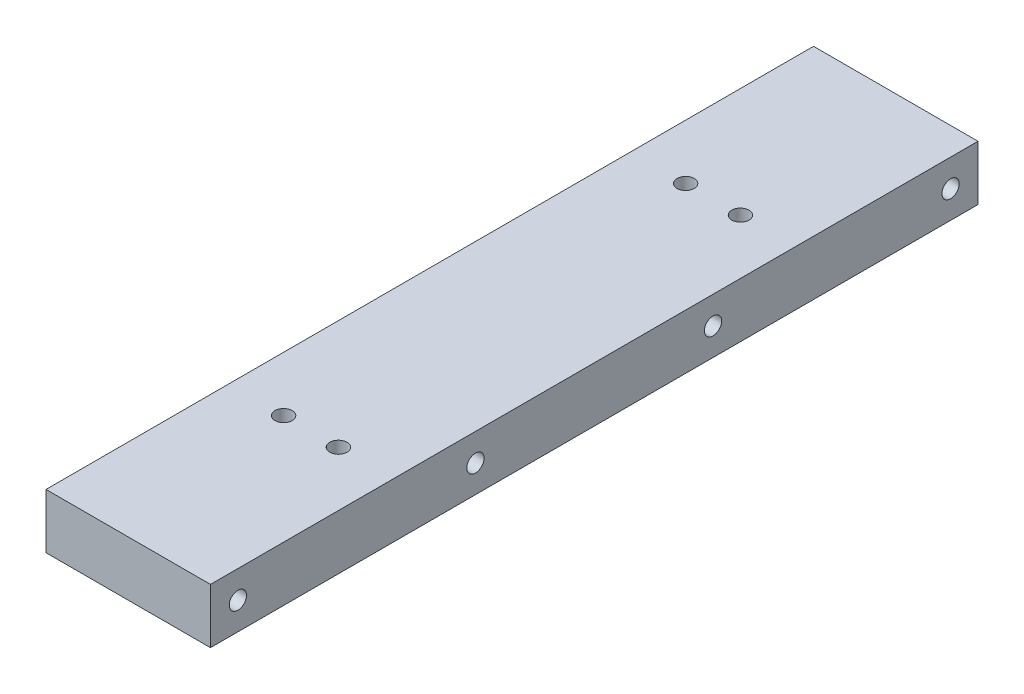
ISO-10303-21;
HEADER;
FILE_DESCRIPTION(('STEP AP214'),'2;1');
FILE_NAME('part.step','',(''),(''),'','','');
FILE_SCHEMA(('AUTOMOTIVE_DESIGN { 1 0 10303 214 1 1 1 1 }'));
ENDSEC;
DATA;
#1=APPLICATION_CONTEXT('core data for automotive mechanical design processes');
#2=APPLICATION_PROTOCOL_DEFINITION('international standard','automotive_design',2000,#1);
#3=PRODUCT_CONTEXT('',#1,'mechanical');
#4=PRODUCT('Part','Part','',(#3));
#5=PRODUCT_RELATED_PRODUCT_CATEGORY('part','',(#4));
#6=PRODUCT_DEFINITION_FORMATION('','',#4);
#7=PRODUCT_DEFINITION_CONTEXT('part definition',#1,'design');
#8=PRODUCT_DEFINITION('design','',#6,#7);
#9=PRODUCT_DEFINITION_SHAPE('','',#8);
#10=(LENGTH_UNIT() NAMED_UNIT(*) SI_UNIT(.MILLI.,.METRE.));
#11=(NAMED_UNIT(*) PLANE_ANGLE_UNIT() SI_UNIT($,.RADIAN.));
#12=(NAMED_UNIT(*) SI_UNIT($,.STERADIAN.) SOLID_ANGLE_UNIT());
#13=UNCERTAINTY_MEASURE_WITH_UNIT(LENGTH_MEASURE(1.E-05),#10,'distance_accuracy_value','');
#14=(GEOMETRIC_REPRESENTATION_CONTEXT(3) GLOBAL_UNCERTAINTY_ASSIGNED_CONTEXT((#13)) GLOBAL_UNIT_ASSIGNED_CONTEXT((#10,
#11,#12)) REPRESENTATION_CONTEXT('',''));
#15=CARTESIAN_POINT('',(0.,0.,0.));
#16=DIRECTION('',(0.,0.,1.));
#17=DIRECTION('',(1.,0.,0.));
#18=AXIS2_PLACEMENT_3D('',#15,#16,#17);
#19=CARTESIAN_POINT('',(28.575,4.7625,-128.5875));
#20=DIRECTION('',(1.,0.,0.));
#21=DIRECTION('',(0.,0.,-1.));
#22=AXIS2_PLACEMENT_3D('',#19,#20,#21);
#23=CYLINDRICAL_SURFACE('',#22,1.5);
#24=CARTESIAN_POINT('',(0.,4.7625,-128.5875));
#25=DIRECTION('',(1.,0.,0.));
#26=DIRECTION('',(0.,0.,-1.));
#27=AXIS2_PLACEMENT_3D('',#24,#25,#26);
#28=CIRCLE('',#27,1.49999999999999);
#29=CARTESIAN_POINT('',(0.,4.7625,-130.0875));
#30=VERTEX_POINT('',#29);
#31=EDGE_CURVE('E56',#30,#30,#28,.T.);
#32=ORIENTED_EDGE('',*,*,#31,.F.);
#33=EDGE_LOOP('',(#32));
#34=FACE_BOUND('',#33,.T.);
#35=CARTESIAN_POINT('',(28.575,4.7625,-128.5875));
#36=DIRECTION('',(1.,0.,0.));
#37=DIRECTION('',(0.,0.,-1.));
#38=AXIS2_PLACEMENT_3D('',#35,#36,#37);
#39=CIRCLE('',#38,1.5);
#40=CARTESIAN_POINT('',(28.575,4.7625,-130.0875));
#41=VERTEX_POINT('',#40);
#42=EDGE_CURVE('E11',#41,#41,#39,.T.);
#43=ORIENTED_EDGE('',*,*,#42,.T.);
#44=EDGE_LOOP('',(#43));
#45=FACE_BOUND('',#44,.T.);
#46=ADVANCED_FACE('F47',(#34,#45),#23,.F.);
#47=CARTESIAN_POINT('',(28.575,4.7625,-87.3125));
#48=DIRECTION('',(1.,0.,0.));
#49=DIRECTION('',(0.,0.,-1.));
#50=AXIS2_PLACEMENT_3D('',#47,#48,#49);
#51=CYLINDRICAL_SURFACE('',#50,1.5);
#52=CARTESIAN_POINT('',(0.,4.7625,-87.3125));
#53=DIRECTION('',(1.,0.,0.));
#54=DIRECTION('',(0.,0.,-1.));
#55=AXIS2_PLACEMENT_3D('',#52,#53,#54);
#56=CIRCLE('',#55,1.49999999999999);
#57=CARTESIAN_POINT('',(0.,4.7625,-88.8125));
#58=VERTEX_POINT('',#57);
#59=EDGE_CURVE('E137',#58,#58,#56,.T.);
#60=ORIENTED_EDGE('',*,*,#59,.F.);
#61=EDGE_LOOP('',(#60));
#62=FACE_BOUND('',#61,.T.);
#63=CARTESIAN_POINT('',(28.575,4.7625,-87.3125));
#64=DIRECTION('',(1.,0.,0.));
#65=DIRECTION('',(0.,0.,-1.));
#66=AXIS2_PLACEMENT_3D('',#63,#64,#65);
#67=CIRCLE('',#66,1.5);
#68=CARTESIAN_POINT('',(28.575,4.7625,-88.8125));
#69=VERTEX_POINT('',#68);
#70=EDGE_CURVE('E141',#69,#69,#67,.T.);
#71=ORIENTED_EDGE('',*,*,#70,.T.);
#72=EDGE_LOOP('',(#71));
#73=FACE_BOUND('',#72,.T.);
#74=ADVANCED_FACE('F152',(#62,#73),#51,.F.);
#75=CARTESIAN_POINT('',(0.,9.525,-133.35));
#76=DIRECTION('',(1.,0.,0.));
#77=DIRECTION('',(0.,0.,-1.));
#78=AXIS2_PLACEMENT_3D('',#75,#76,#77);
#79=PLANE('',#78);
#80=CARTESIAN_POINT('',(0.,4.7625,-46.0375));
#81=DIRECTION('',(1.,0.,0.));
#82=DIRECTION('',(0.,0.,-1.));
#83=AXIS2_PLACEMENT_3D('',#80,#81,#82);
#84=CIRCLE('',#83,1.49999999999999);
#85=CARTESIAN_POINT('',(0.,4.7625,-47.5375));
#86=VERTEX_POINT('',#85);
#87=EDGE_CURVE('E291',#86,#86,#84,.T.);
#88=ORIENTED_EDGE('',*,*,#87,.T.);
#89=EDGE_LOOP('',(#88));
#90=FACE_BOUND('',#89,.T.);
#91=CARTESIAN_POINT('',(0.,4.7625,-4.7625));
#92=DIRECTION('',(1.,0.,0.));
#93=DIRECTION('',(0.,0.,-1.));
#94=AXIS2_PLACEMENT_3D('',#91,#92,#93);
#95=CIRCLE('',#94,1.49999999999999);
#96=CARTESIAN_POINT('',(0.,4.7625,-6.2625));
#97=VERTEX_POINT('',#96);
#98=EDGE_CURVE('E124',#97,#97,#95,.T.);
#99=ORIENTED_EDGE('',*,*,#98,.T.);
#100=EDGE_LOOP('',(#99));
#101=FACE_BOUND('',#100,.T.);
#102=DIRECTION('',(0.,0.,1.));
#103=VECTOR('',#102,1.);
#104=CARTESIAN_POINT('',(0.,0.,-133.35));
#105=LINE('',#104,#103);
#106=CARTESIAN_POINT('',(0.,0.,-133.35));
#107=VERTEX_POINT('',#106);
#108=CARTESIAN_POINT('',(0.,0.,0.));
#109=VERTEX_POINT('',#108);
#110=EDGE_CURVE('E120',#107,#109,#105,.T.);
#111=ORIENTED_EDGE('',*,*,#110,.T.);
#112=DIRECTION('',(0.,-1.,0.));
#113=VECTOR('',#112,1.);
#114=CARTESIAN_POINT('',(0.,9.525,0.));
#115=LINE('',#114,#113);
#116=CARTESIAN_POINT('',(0.,9.525,0.));
#117=VERTEX_POINT('',#116);
#118=EDGE_CURVE('E108',#117,#109,#115,.T.);
#119=ORIENTED_EDGE('',*,*,#118,.F.);
#120=DIRECTION('',(0.,0.,1.));
#121=VECTOR('',#120,1.);
#122=CARTESIAN_POINT('',(0.,9.525,-133.35));
#123=LINE('',#122,#121);
#124=CARTESIAN_POINT('',(0.,9.525,-133.35));
#125=VERTEX_POINT('',#124);
#126=EDGE_CURVE('E100',#125,#117,#123,.T.);
#127=ORIENTED_EDGE('',*,*,#126,.F.);
#128=DIRECTION('',(0.,-1.,0.));
#129=VECTOR('',#128,1.);
#130=CARTESIAN_POINT('',(0.,9.525,-133.35));
#131=LINE('',#130,#129);
#132=EDGE_CURVE('E116',#125,#107,#131,.T.);
#133=ORIENTED_EDGE('',*,*,#132,.T.);
#134=EDGE_LOOP('',(#111,#119,#127,#133));
#135=FACE_BOUND('',#134,.T.);
#136=ORIENTED_EDGE('',*,*,#59,.T.);
#137=EDGE_LOOP('',(#136));
#138=FACE_BOUND('',#137,.T.);
#139=ORIENTED_EDGE('',*,*,#31,.T.);
#140=EDGE_LOOP('',(#139));
#141=FACE_BOUND('',#140,.T.);
#142=ADVANCED_FACE('F148',(#90,#101,#135,#138,#141),#79,.F.);
#143=CARTESIAN_POINT('',(0.,9.525,0.));
#144=DIRECTION('',(0.,0.,-1.));
#145=DIRECTION('',(-1.,0.,0.));
#146=AXIS2_PLACEMENT_3D('',#143,#144,#145);
#147=PLANE('',#146);
#148=DIRECTION('',(1.,0.,0.));
#149=VECTOR('',#148,1.);
#150=CARTESIAN_POINT('',(0.,0.,0.));
#151=LINE('',#150,#149);
#152=CARTESIAN_POINT('',(28.575,0.,0.));
#153=VERTEX_POINT('',#152);
#154=EDGE_CURVE('E106',#109,#153,#151,.T.);
#155=ORIENTED_EDGE('',*,*,#154,.T.);
#156=DIRECTION('',(0.,-1.,0.));
#157=VECTOR('',#156,1.);
#158=CARTESIAN_POINT('',(28.575,9.525,0.));
#159=LINE('',#158,#157);
#160=CARTESIAN_POINT('',(28.575,9.525,0.));
#161=VERTEX_POINT('',#160);
#162=EDGE_CURVE('E104',#161,#153,#159,.T.);
#163=ORIENTED_EDGE('',*,*,#162,.F.);
#164=DIRECTION('',(1.,0.,0.));
#165=VECTOR('',#164,1.);
#166=CARTESIAN_POINT('',(0.,9.525,0.));
#167=LINE('',#166,#165);
#168=EDGE_CURVE('E95',#117,#161,#167,.T.);
#169=ORIENTED_EDGE('',*,*,#168,.F.);
#170=ORIENTED_EDGE('',*,*,#118,.T.);
#171=EDGE_LOOP('',(#155,#163,#169,#170));
#172=FACE_BOUND('',#171,.T.);
#173=ADVANCED_FACE('F105',(#172),#147,.F.);
#174=CARTESIAN_POINT('',(28.575,9.525,0.));
#175=DIRECTION('',(-1.,0.,0.));
#176=DIRECTION('',(0.,0.,1.));
#177=AXIS2_PLACEMENT_3D('',#174,#175,#176);
#178=PLANE('',#177);
#179=CARTESIAN_POINT('',(28.575,4.7625,-46.0375));
#180=DIRECTION('',(1.,0.,0.));
#181=DIRECTION('',(0.,0.,-1.));
#182=AXIS2_PLACEMENT_3D('',#179,#180,#181);
#183=CIRCLE('',#182,1.5);
#184=CARTESIAN_POINT('',(28.575,4.7625,-47.5375));
#185=VERTEX_POINT('',#184);
#186=EDGE_CURVE('E293',#185,#185,#183,.T.);
#187=ORIENTED_EDGE('',*,*,#186,.F.);
#188=EDGE_LOOP('',(#187));
#189=FACE_BOUND('',#188,.T.);
#190=CARTESIAN_POINT('',(28.575,4.7625,-4.7625));
#191=DIRECTION('',(1.,0.,0.));
#192=DIRECTION('',(0.,0.,-1.));
#193=AXIS2_PLACEMENT_3D('',#190,#191,#192);
#194=CIRCLE('',#193,1.5);
#195=CARTESIAN_POINT('',(28.575,4.7625,-6.2625));
#196=VERTEX_POINT('',#195);
#197=EDGE_CURVE('E295',#196,#196,#194,.T.);
#198=ORIENTED_EDGE('',*,*,#197,.F.);
#199=EDGE_LOOP('',(#198));
#200=FACE_BOUND('',#199,.T.);
#201=DIRECTION('',(0.,0.,-1.));
#202=VECTOR('',#201,1.);
#203=CARTESIAN_POINT('',(28.575,0.,0.));
#204=LINE('',#203,#202);
#205=CARTESIAN_POINT('',(28.575,0.,-133.35));
#206=VERTEX_POINT('',#205);
#207=EDGE_CURVE('E81',#153,#206,#204,.T.);
#208=ORIENTED_EDGE('',*,*,#207,.T.);
#209=DIRECTION('',(0.,-1.,0.));
#210=VECTOR('',#209,1.);
#211=CARTESIAN_POINT('',(28.575,9.525,-133.35));
#212=LINE('',#211,#210);
#213=CARTESIAN_POINT('',(28.575,9.525,-133.35));
#214=VERTEX_POINT('',#213);
#215=EDGE_CURVE('E109',#214,#206,#212,.T.);
#216=ORIENTED_EDGE('',*,*,#215,.F.);
#217=DIRECTION('',(0.,0.,-1.));
#218=VECTOR('',#217,1.);
#219=CARTESIAN_POINT('',(28.575,9.525,0.));
#220=LINE('',#219,#218);
#221=EDGE_CURVE('E98',#161,#214,#220,.T.);
#222=ORIENTED_EDGE('',*,*,#221,.F.);
#223=ORIENTED_EDGE('',*,*,#162,.T.);
#224=EDGE_LOOP('',(#208,#216,#222,#223));
#225=FACE_BOUND('',#224,.T.);
#226=ORIENTED_EDGE('',*,*,#70,.F.);
#227=EDGE_LOOP('',(#226));
#228=FACE_BOUND('',#227,.T.);
#229=ORIENTED_EDGE('',*,*,#42,.F.);
#230=EDGE_LOOP('',(#229));
#231=FACE_BOUND('',#230,.T.);
#232=ADVANCED_FACE('F111',(#189,#200,#225,#228,#231),#178,.F.);
#233=CARTESIAN_POINT('',(28.575,9.525,-133.35));
#234=DIRECTION('',(0.,0.,1.));
#235=DIRECTION('',(1.,0.,0.));
#236=AXIS2_PLACEMENT_3D('',#233,#234,#235);
#237=PLANE('',#236);
#238=DIRECTION('',(-1.,0.,0.));
#239=VECTOR('',#238,1.);
#240=CARTESIAN_POINT('',(28.575,0.,-133.35));
#241=LINE('',#240,#239);
#242=EDGE_CURVE('E87',#206,#107,#241,.T.);
#243=ORIENTED_EDGE('',*,*,#242,.T.);
#244=ORIENTED_EDGE('',*,*,#132,.F.);
#245=DIRECTION('',(-1.,0.,0.));
#246=VECTOR('',#245,1.);
#247=CARTESIAN_POINT('',(28.575,9.525,-133.35));
#248=LINE('',#247,#246);
#249=EDGE_CURVE('E64',#214,#125,#248,.T.);
#250=ORIENTED_EDGE('',*,*,#249,.F.);
#251=ORIENTED_EDGE('',*,*,#215,.T.);
#252=EDGE_LOOP('',(#243,#244,#250,#251));
#253=FACE_BOUND('',#252,.T.);
#254=ADVANCED_FACE('F156',(#253),#237,.F.);
#255=CARTESIAN_POINT('',(0.,9.525,0.));
#256=DIRECTION('',(0.,1.,0.));
#257=DIRECTION('',(0.,0.,1.));
#258=AXIS2_PLACEMENT_3D('',#255,#256,#257);
#259=PLANE('',#258);
#260=CARTESIAN_POINT('',(19.05,9.525,-31.75));
#261=DIRECTION('',(0.,-1.,0.));
#262=DIRECTION('',(0.,0.,-1.));
#263=AXIS2_PLACEMENT_3D('',#260,#261,#262);
#264=CIRCLE('',#263,1.5);
#265=CARTESIAN_POINT('',(19.05,9.525,-33.25));
#266=VERTEX_POINT('',#265);
#267=EDGE_CURVE('E323',#266,#266,#264,.T.);
#268=ORIENTED_EDGE('',*,*,#267,.T.);
#269=EDGE_LOOP('',(#268));
#270=FACE_BOUND('',#269,.T.);
#271=CARTESIAN_POINT('',(19.05,9.525,-101.6));
#272=DIRECTION('',(0.,-1.,0.));
#273=DIRECTION('',(0.,0.,-1.));
#274=AXIS2_PLACEMENT_3D('',#271,#272,#273);
#275=CIRCLE('',#274,1.5);
#276=CARTESIAN_POINT('',(19.05,9.525,-103.1));
#277=VERTEX_POINT('',#276);
#278=EDGE_CURVE('E331',#277,#277,#275,.T.);
#279=ORIENTED_EDGE('',*,*,#278,.T.);
#280=EDGE_LOOP('',(#279));
#281=FACE_BOUND('',#280,.T.);
#282=CARTESIAN_POINT('',(9.525,9.525,-101.6));
#283=DIRECTION('',(0.,-1.,0.));
#284=DIRECTION('',(0.,0.,-1.));
#285=AXIS2_PLACEMENT_3D('',#282,#283,#284);
#286=CIRCLE('',#285,1.5);
#287=CARTESIAN_POINT('',(9.525,9.525,-103.1));
#288=VERTEX_POINT('',#287);
#289=EDGE_CURVE('E339',#288,#288,#286,.T.);
#290=ORIENTED_EDGE('',*,*,#289,.T.);
#291=EDGE_LOOP('',(#290));
#292=FACE_BOUND('',#291,.T.);
#293=CARTESIAN_POINT('',(9.525,9.525,-31.75));
#294=DIRECTION('',(0.,-1.,0.));
#295=DIRECTION('',(0.,0.,-1.));
#296=AXIS2_PLACEMENT_3D('',#293,#294,#295);
#297=CIRCLE('',#296,1.5);
#298=CARTESIAN_POINT('',(9.525,9.525,-33.25));
#299=VERTEX_POINT('',#298);
#300=EDGE_CURVE('E301',#299,#299,#297,.T.);
#301=ORIENTED_EDGE('',*,*,#300,.T.);
#302=EDGE_LOOP('',(#301));
#303=FACE_BOUND('',#302,.T.);
#304=ORIENTED_EDGE('',*,*,#126,.T.);
#305=ORIENTED_EDGE('',*,*,#168,.T.);
#306=ORIENTED_EDGE('',*,*,#221,.T.);
#307=ORIENTED_EDGE('',*,*,#249,.T.);
#308=EDGE_LOOP('',(#304,#305,#306,#307));
#309=FACE_BOUND('',#308,.T.);
#310=ADVANCED_FACE('F96',(#270,#281,#292,#303,#309),#259,.T.);
#311=CARTESIAN_POINT('',(0.,0.,0.));
#312=DIRECTION('',(0.,1.,0.));
#313=DIRECTION('',(0.,0.,1.));
#314=AXIS2_PLACEMENT_3D('',#311,#312,#313);
#315=PLANE('',#314);
#316=CARTESIAN_POINT('',(19.05,0.,-31.75));
#317=DIRECTION('',(0.,-1.,0.));
#318=DIRECTION('',(0.,0.,-1.));
#319=AXIS2_PLACEMENT_3D('',#316,#317,#318);
#320=CIRCLE('',#319,1.5);
#321=CARTESIAN_POINT('',(19.05,0.,-33.25));
#322=VERTEX_POINT('',#321);
#323=EDGE_CURVE('E327',#322,#322,#320,.T.);
#324=ORIENTED_EDGE('',*,*,#323,.F.);
#325=EDGE_LOOP('',(#324));
#326=FACE_BOUND('',#325,.T.);
#327=CARTESIAN_POINT('',(19.05,0.,-101.6));
#328=DIRECTION('',(0.,-1.,0.));
#329=DIRECTION('',(0.,0.,-1.));
#330=AXIS2_PLACEMENT_3D('',#327,#328,#329);
#331=CIRCLE('',#330,1.5);
#332=CARTESIAN_POINT('',(19.05,0.,-103.1));
#333=VERTEX_POINT('',#332);
#334=EDGE_CURVE('E335',#333,#333,#331,.T.);
#335=ORIENTED_EDGE('',*,*,#334,.F.);
#336=EDGE_LOOP('',(#335));
#337=FACE_BOUND('',#336,.T.);
#338=CARTESIAN_POINT('',(9.525,0.,-101.6));
#339=DIRECTION('',(0.,-1.,0.));
#340=DIRECTION('',(0.,0.,-1.));
#341=AXIS2_PLACEMENT_3D('',#338,#339,#340);
#342=CIRCLE('',#341,1.5);
#343=CARTESIAN_POINT('',(9.525,0.,-103.1));
#344=VERTEX_POINT('',#343);
#345=EDGE_CURVE('E319',#344,#344,#342,.T.);
#346=ORIENTED_EDGE('',*,*,#345,.F.);
#347=EDGE_LOOP('',(#346));
#348=FACE_BOUND('',#347,.T.);
#349=CARTESIAN_POINT('',(9.525,0.,-31.75));
#350=DIRECTION('',(0.,-1.,0.));
#351=DIRECTION('',(0.,0.,-1.));
#352=AXIS2_PLACEMENT_3D('',#349,#350,#351);
#353=CIRCLE('',#352,1.5);
#354=CARTESIAN_POINT('',(9.525,0.,-33.25));
#355=VERTEX_POINT('',#354);
#356=EDGE_CURVE('E315',#355,#355,#353,.T.);
#357=ORIENTED_EDGE('',*,*,#356,.F.);
#358=EDGE_LOOP('',(#357));
#359=FACE_BOUND('',#358,.T.);
#360=ORIENTED_EDGE('',*,*,#110,.F.);
#361=ORIENTED_EDGE('',*,*,#242,.F.);
#362=ORIENTED_EDGE('',*,*,#207,.F.);
#363=ORIENTED_EDGE('',*,*,#154,.F.);
#364=EDGE_LOOP('',(#360,#361,#362,#363));
#365=FACE_BOUND('',#364,.T.);
#366=ADVANCED_FACE('F215',(#326,#337,#348,#359,#365),#315,.F.);
#367=CARTESIAN_POINT('',(28.575,4.7625,-4.7625));
#368=DIRECTION('',(1.,0.,0.));
#369=DIRECTION('',(0.,0.,-1.));
#370=AXIS2_PLACEMENT_3D('',#367,#368,#369);
#371=CYLINDRICAL_SURFACE('',#370,1.5);
#372=ORIENTED_EDGE('',*,*,#98,.F.);
#373=EDGE_LOOP('',(#372));
#374=FACE_BOUND('',#373,.T.);
#375=ORIENTED_EDGE('',*,*,#197,.T.);
#376=EDGE_LOOP('',(#375));
#377=FACE_BOUND('',#376,.T.);
#378=ADVANCED_FACE('F225',(#374,#377),#371,.F.);
#379=CARTESIAN_POINT('',(28.575,4.7625,-46.0375));
#380=DIRECTION('',(1.,0.,0.));
#381=DIRECTION('',(0.,0.,-1.));
#382=AXIS2_PLACEMENT_3D('',#379,#380,#381);
#383=CYLINDRICAL_SURFACE('',#382,1.5);
#384=ORIENTED_EDGE('',*,*,#87,.F.);
#385=EDGE_LOOP('',(#384));
#386=FACE_BOUND('',#385,.T.);
#387=ORIENTED_EDGE('',*,*,#186,.T.);
#388=EDGE_LOOP('',(#387));
#389=FACE_BOUND('',#388,.T.);
#390=ADVANCED_FACE('F233',(#386,#389),#383,.F.);
#391=CARTESIAN_POINT('',(9.525,9.525,-31.75));
#392=DIRECTION('',(0.,-1.,0.));
#393=DIRECTION('',(0.,0.,-1.));
#394=AXIS2_PLACEMENT_3D('',#391,#392,#393);
#395=CYLINDRICAL_SURFACE('',#394,1.5);
#396=CARTESIAN_POINT('',(9.525,9.525,-33.25));
#397=CARTESIAN_POINT('',(9.525,9.42578125,-33.25));
#398=CARTESIAN_POINT('',(9.525,9.3265625,-33.25));
#399=CARTESIAN_POINT('',(9.525,9.128125,-33.25));
#400=CARTESIAN_POINT('',(9.525,9.02890625,-33.25));
#401=CARTESIAN_POINT('',(9.525,8.83046875,-33.25));
#402=CARTESIAN_POINT('',(9.525,8.73125,-33.25));
#403=CARTESIAN_POINT('',(9.525,8.5328125,-33.25));
#404=CARTESIAN_POINT('',(9.525,8.43359375,-33.25));
#405=CARTESIAN_POINT('',(9.525,8.23515625,-33.25));
#406=CARTESIAN_POINT('',(9.525,8.1359375,-33.25));
#407=CARTESIAN_POINT('',(9.525,7.9375,-33.25));
#408=CARTESIAN_POINT('',(9.525,7.83828125,-33.25));
#409=CARTESIAN_POINT('',(9.525,7.63984375,-33.25));
#410=CARTESIAN_POINT('',(9.525,7.540625,-33.25));
#411=CARTESIAN_POINT('',(9.525,7.3421875,-33.25));
#412=CARTESIAN_POINT('',(9.525,7.24296875,-33.25));
#413=CARTESIAN_POINT('',(9.525,7.04453125,-33.25));
#414=CARTESIAN_POINT('',(9.525,6.9453125,-33.25));
#415=CARTESIAN_POINT('',(9.525,6.746875,-33.25));
#416=CARTESIAN_POINT('',(9.525,6.64765625,-33.25));
#417=CARTESIAN_POINT('',(9.525,6.44921875,-33.25));
#418=CARTESIAN_POINT('',(9.525,6.35,-33.25));
#419=CARTESIAN_POINT('',(9.525,6.1515625,-33.25));
#420=CARTESIAN_POINT('',(9.525,6.05234375,-33.25));
#421=CARTESIAN_POINT('',(9.525,5.85390625,-33.25));
#422=CARTESIAN_POINT('',(9.525,5.7546875,-33.25));
#423=CARTESIAN_POINT('',(9.525,5.55625,-33.25));
#424=CARTESIAN_POINT('',(9.525,5.45703125,-33.25));
#425=CARTESIAN_POINT('',(9.525,5.25859375,-33.25));
#426=CARTESIAN_POINT('',(9.525,5.159375,-33.25));
#427=CARTESIAN_POINT('',(9.525,4.9609375,-33.25));
#428=CARTESIAN_POINT('',(9.525,4.86171875,-33.25));
#429=CARTESIAN_POINT('',(9.525,4.66328125,-33.25));
#430=CARTESIAN_POINT('',(9.525,4.5640625,-33.25));
#431=CARTESIAN_POINT('',(9.525,4.365625,-33.25));
#432=CARTESIAN_POINT('',(9.525,4.26640625,-33.25));
#433=CARTESIAN_POINT('',(9.525,4.06796875,-33.25));
#434=CARTESIAN_POINT('',(9.525,3.96875,-33.25));
#435=CARTESIAN_POINT('',(9.525,3.7703125,-33.25));
#436=CARTESIAN_POINT('',(9.525,3.67109375,-33.25));
#437=CARTESIAN_POINT('',(9.525,3.47265625,-33.25));
#438=CARTESIAN_POINT('',(9.525,3.3734375,-33.25));
#439=CARTESIAN_POINT('',(9.525,3.175,-33.25));
#440=CARTESIAN_POINT('',(9.525,3.07578125,-33.25));
#441=CARTESIAN_POINT('',(9.525,2.87734375,-33.25));
#442=CARTESIAN_POINT('',(9.525,2.778125,-33.25));
#443=CARTESIAN_POINT('',(9.525,2.5796875,-33.25));
#444=CARTESIAN_POINT('',(9.525,2.48046875,-33.25));
#445=CARTESIAN_POINT('',(9.525,2.28203125,-33.25));
#446=CARTESIAN_POINT('',(9.525,2.1828125,-33.25));
#447=CARTESIAN_POINT('',(9.525,1.984375,-33.25));
#448=CARTESIAN_POINT('',(9.525,1.88515625,-33.25));
#449=CARTESIAN_POINT('',(9.525,1.68671875,-33.25));
#450=CARTESIAN_POINT('',(9.525,1.5875,-33.25));
#451=CARTESIAN_POINT('',(9.525,1.3890625,-33.25));
#452=CARTESIAN_POINT('',(9.525,1.28984375,-33.25));
#453=CARTESIAN_POINT('',(9.525,1.09140625,-33.25));
#454=CARTESIAN_POINT('',(9.525,0.992187500000001,-33.25));
#455=CARTESIAN_POINT('',(9.525,0.793750000000001,-33.25));
#456=CARTESIAN_POINT('',(9.525,0.69453125,-33.25));
#457=CARTESIAN_POINT('',(9.525,0.49609375,-33.25));
#458=CARTESIAN_POINT('',(9.525,0.396875,-33.25));
#459=CARTESIAN_POINT('',(9.525,0.1984375,-33.25));
#460=CARTESIAN_POINT('',(9.525,0.0992187500000001,-33.25));
#461=CARTESIAN_POINT('',(9.525,0.,-33.25));
#462=B_SPLINE_CURVE_WITH_KNOTS('',3,(#396,#397,#398,#399,#400,#401,#402,#403,#404,#405,#406,
#407,#408,#409,#410,#411,#412,#413,#414,#415,#416,#417,#418,#419,#420,#421,#422,#423,#424,#425,
#426,#427,#428,#429,#430,#431,#432,#433,#434,#435,#436,#437,#438,#439,#440,#441,#442,#443,#444,
#445,#446,#447,#448,#449,#450,#451,#452,#453,#454,#455,#456,#457,#458,#459,#460,#461),
.UNSPECIFIED.,.F.,.F.,(4,2,2,2,2,2,2,2,2,2,2,2,2,2,2,2,2,2,2,2,2,2,2,2,2,2,2,2,2,2,2,2,4),(0.,
0.297656249999998,0.595312499999999,0.892968749999999,1.190625,1.48828125,1.7859375,2.08359375,
2.38125,2.67890625,2.9765625,3.27421875,3.571875,3.86953125,4.1671875,4.46484375,4.7625,
5.06015625,5.3578125,5.65546875,5.953125,6.25078125,6.5484375,6.84609375,7.14375,7.44140625,
7.7390625,8.03671875,8.334375,8.63203125,8.9296875,9.22734375,9.525),.UNSPECIFIED.);
#463=EDGE_CURVE('BSEAM245',#299,#355,#462,.T.);
#464=ORIENTED_EDGE('',*,*,#300,.F.);
#465=ORIENTED_EDGE('',*,*,#356,.T.);
#466=ORIENTED_EDGE('',*,*,#463,.T.);
#467=ORIENTED_EDGE('',*,*,#463,.F.);
#468=EDGE_LOOP('',(#464,#466,#465,#467));
#469=FACE_BOUND('',#468,.T.);
#470=ADVANCED_FACE('F245',(#469),#395,.F.);
#471=CARTESIAN_POINT('',(9.525,9.525,-101.6));
#472=DIRECTION('',(0.,-1.,0.));
#473=DIRECTION('',(0.,0.,-1.));
#474=AXIS2_PLACEMENT_3D('',#471,#472,#473);
#475=CYLINDRICAL_SURFACE('',#474,1.5);
#476=CARTESIAN_POINT('',(9.525,9.525,-103.1));
#477=CARTESIAN_POINT('',(9.525,9.42578125,-103.1));
#478=CARTESIAN_POINT('',(9.525,9.3265625,-103.1));
#479=CARTESIAN_POINT('',(9.525,9.128125,-103.1));
#480=CARTESIAN_POINT('',(9.525,9.02890625,-103.1));
#481=CARTESIAN_POINT('',(9.525,8.83046875,-103.1));
#482=CARTESIAN_POINT('',(9.525,8.73125,-103.1));
#483=CARTESIAN_POINT('',(9.525,8.5328125,-103.1));
#484=CARTESIAN_POINT('',(9.525,8.43359375,-103.1));
#485=CARTESIAN_POINT('',(9.525,8.23515625,-103.1));
#486=CARTESIAN_POINT('',(9.525,8.1359375,-103.1));
#487=CARTESIAN_POINT('',(9.525,7.9375,-103.1));
#488=CARTESIAN_POINT('',(9.525,7.83828125,-103.1));
#489=CARTESIAN_POINT('',(9.525,7.63984375,-103.1));
#490=CARTESIAN_POINT('',(9.525,7.540625,-103.1));
#491=CARTESIAN_POINT('',(9.525,7.3421875,-103.1));
#492=CARTESIAN_POINT('',(9.525,7.24296875,-103.1));
#493=CARTESIAN_POINT('',(9.525,7.04453125,-103.1));
#494=CARTESIAN_POINT('',(9.525,6.9453125,-103.1));
#495=CARTESIAN_POINT('',(9.525,6.746875,-103.1));
#496=CARTESIAN_POINT('',(9.525,6.64765625,-103.1));
#497=CARTESIAN_POINT('',(9.525,6.44921875,-103.1));
#498=CARTESIAN_POINT('',(9.525,6.35,-103.1));
#499=CARTESIAN_POINT('',(9.525,6.1515625,-103.1));
#500=CARTESIAN_POINT('',(9.525,6.05234375,-103.1));
#501=CARTESIAN_POINT('',(9.525,5.85390625,-103.1));
#502=CARTESIAN_POINT('',(9.525,5.7546875,-103.1));
#503=CARTESIAN_POINT('',(9.525,5.55625,-103.1));
#504=CARTESIAN_POINT('',(9.525,5.45703125,-103.1));
#505=CARTESIAN_POINT('',(9.525,5.25859375,-103.1));
#506=CARTESIAN_POINT('',(9.525,5.159375,-103.1));
#507=CARTESIAN_POINT('',(9.525,4.9609375,-103.1));
#508=CARTESIAN_POINT('',(9.525,4.86171875,-103.1));
#509=CARTESIAN_POINT('',(9.525,4.66328125,-103.1));
#510=CARTESIAN_POINT('',(9.525,4.5640625,-103.1));
#511=CARTESIAN_POINT('',(9.525,4.365625,-103.1));
#512=CARTESIAN_POINT('',(9.525,4.26640625,-103.1));
#513=CARTESIAN_POINT('',(9.525,4.06796875,-103.1));
#514=CARTESIAN_POINT('',(9.525,3.96875,-103.1));
#515=CARTESIAN_POINT('',(9.525,3.7703125,-103.1));
#516=CARTESIAN_POINT('',(9.525,3.67109375,-103.1));
#517=CARTESIAN_POINT('',(9.525,3.47265625,-103.1));
#518=CARTESIAN_POINT('',(9.525,3.3734375,-103.1));
#519=CARTESIAN_POINT('',(9.525,3.175,-103.1));
#520=CARTESIAN_POINT('',(9.525,3.07578125,-103.1));
#521=CARTESIAN_POINT('',(9.525,2.87734375,-103.1));
#522=CARTESIAN_POINT('',(9.525,2.778125,-103.1));
#523=CARTESIAN_POINT('',(9.525,2.5796875,-103.1));
#524=CARTESIAN_POINT('',(9.525,2.48046875,-103.1));
#525=CARTESIAN_POINT('',(9.525,2.28203125,-103.1));
#526=CARTESIAN_POINT('',(9.525,2.1828125,-103.1));
#527=CARTESIAN_POINT('',(9.525,1.984375,-103.1));
#528=CARTESIAN_POINT('',(9.525,1.88515625,-103.1));
#529=CARTESIAN_POINT('',(9.525,1.68671875,-103.1));
#530=CARTESIAN_POINT('',(9.525,1.5875,-103.1));
#531=CARTESIAN_POINT('',(9.525,1.3890625,-103.1));
#532=CARTESIAN_POINT('',(9.525,1.28984375,-103.1));
#533=CARTESIAN_POINT('',(9.525,1.09140625,-103.1));
#534=CARTESIAN_POINT('',(9.525,0.992187500000001,-103.1));
#535=CARTESIAN_POINT('',(9.525,0.793750000000001,-103.1));
#536=CARTESIAN_POINT('',(9.525,0.69453125,-103.1));
#537=CARTESIAN_POINT('',(9.525,0.49609375,-103.1));
#538=CARTESIAN_POINT('',(9.525,0.396875,-103.1));
#539=CARTESIAN_POINT('',(9.525,0.1984375,-103.1));
#540=CARTESIAN_POINT('',(9.525,0.0992187500000001,-103.1));
#541=CARTESIAN_POINT('',(9.525,0.,-103.1));
#542=B_SPLINE_CURVE_WITH_KNOTS('',3,(#476,#477,#478,#479,#480,#481,#482,#483,#484,#485,#486,
#487,#488,#489,#490,#491,#492,#493,#494,#495,#496,#497,#498,#499,#500,#501,#502,#503,#504,#505,
#506,#507,#508,#509,#510,#511,#512,#513,#514,#515,#516,#517,#518,#519,#520,#521,#522,#523,#524,
#525,#526,#527,#528,#529,#530,#531,#532,#533,#534,#535,#536,#537,#538,#539,#540,#541),
.UNSPECIFIED.,.F.,.F.,(4,2,2,2,2,2,2,2,2,2,2,2,2,2,2,2,2,2,2,2,2,2,2,2,2,2,2,2,2,2,2,2,4),(0.,
0.297656249999998,0.595312499999999,0.892968749999999,1.190625,1.48828125,1.7859375,2.08359375,
2.38125,2.67890625,2.9765625,3.27421875,3.571875,3.86953125,4.1671875,4.46484375,4.7625,
5.06015625,5.3578125,5.65546875,5.953125,6.25078125,6.5484375,6.84609375,7.14375,7.44140625,
7.7390625,8.03671875,8.334375,8.63203125,8.9296875,9.22734375,9.525),.UNSPECIFIED.);
#543=EDGE_CURVE('BSEAM249',#288,#344,#542,.T.);
#544=ORIENTED_EDGE('',*,*,#289,.F.);
#545=ORIENTED_EDGE('',*,*,#345,.T.);
#546=ORIENTED_EDGE('',*,*,#543,.T.);
#547=ORIENTED_EDGE('',*,*,#543,.F.);
#548=EDGE_LOOP('',(#544,#546,#545,#547));
#549=FACE_BOUND('',#548,.T.);
#550=ADVANCED_FACE('F249',(#549),#475,.F.);
#551=CARTESIAN_POINT('',(19.05,9.525,-101.6));
#552=DIRECTION('',(0.,-1.,0.));
#553=DIRECTION('',(0.,0.,-1.));
#554=AXIS2_PLACEMENT_3D('',#551,#552,#553);
#555=CYLINDRICAL_SURFACE('',#554,1.5);
#556=CARTESIAN_POINT('',(19.05,9.525,-103.1));
#557=CARTESIAN_POINT('',(19.05,9.42578125,-103.1));
#558=CARTESIAN_POINT('',(19.05,9.3265625,-103.1));
#559=CARTESIAN_POINT('',(19.05,9.128125,-103.1));
#560=CARTESIAN_POINT('',(19.05,9.02890625,-103.1));
#561=CARTESIAN_POINT('',(19.05,8.83046875,-103.1));
#562=CARTESIAN_POINT('',(19.05,8.73125,-103.1));
#563=CARTESIAN_POINT('',(19.05,8.5328125,-103.1));
#564=CARTESIAN_POINT('',(19.05,8.43359375,-103.1));
#565=CARTESIAN_POINT('',(19.05,8.23515625,-103.1));
#566=CARTESIAN_POINT('',(19.05,8.1359375,-103.1));
#567=CARTESIAN_POINT('',(19.05,7.9375,-103.1));
#568=CARTESIAN_POINT('',(19.05,7.83828125,-103.1));
#569=CARTESIAN_POINT('',(19.05,7.63984375,-103.1));
#570=CARTESIAN_POINT('',(19.05,7.540625,-103.1));
#571=CARTESIAN_POINT('',(19.05,7.3421875,-103.1));
#572=CARTESIAN_POINT('',(19.05,7.24296875,-103.1));
#573=CARTESIAN_POINT('',(19.05,7.04453125,-103.1));
#574=CARTESIAN_POINT('',(19.05,6.9453125,-103.1));
#575=CARTESIAN_POINT('',(19.05,6.746875,-103.1));
#576=CARTESIAN_POINT('',(19.05,6.64765625,-103.1));
#577=CARTESIAN_POINT('',(19.05,6.44921875,-103.1));
#578=CARTESIAN_POINT('',(19.05,6.35,-103.1));
#579=CARTESIAN_POINT('',(19.05,6.1515625,-103.1));
#580=CARTESIAN_POINT('',(19.05,6.05234375,-103.1));
#581=CARTESIAN_POINT('',(19.05,5.85390625,-103.1));
#582=CARTESIAN_POINT('',(19.05,5.7546875,-103.1));
#583=CARTESIAN_POINT('',(19.05,5.55625,-103.1));
#584=CARTESIAN_POINT('',(19.05,5.45703125,-103.1));
#585=CARTESIAN_POINT('',(19.05,5.25859375,-103.1));
#586=CARTESIAN_POINT('',(19.05,5.159375,-103.1));
#587=CARTESIAN_POINT('',(19.05,4.9609375,-103.1));
#588=CARTESIAN_POINT('',(19.05,4.86171875,-103.1));
#589=CARTESIAN_POINT('',(19.05,4.66328125,-103.1));
#590=CARTESIAN_POINT('',(19.05,4.5640625,-103.1));
#591=CARTESIAN_POINT('',(19.05,4.365625,-103.1));
#592=CARTESIAN_POINT('',(19.05,4.26640625,-103.1));
#593=CARTESIAN_POINT('',(19.05,4.06796875,-103.1));
#594=CARTESIAN_POINT('',(19.05,3.96875,-103.1));
#595=CARTESIAN_POINT('',(19.05,3.7703125,-103.1));
#596=CARTESIAN_POINT('',(19.05,3.67109375,-103.1));
#597=CARTESIAN_POINT('',(19.05,3.47265625,-103.1));
#598=CARTESIAN_POINT('',(19.05,3.3734375,-103.1));
#599=CARTESIAN_POINT('',(19.05,3.175,-103.1));
#600=CARTESIAN_POINT('',(19.05,3.07578125,-103.1));
#601=CARTESIAN_POINT('',(19.05,2.87734375,-103.1));
#602=CARTESIAN_POINT('',(19.05,2.778125,-103.1));
#603=CARTESIAN_POINT('',(19.05,2.5796875,-103.1));
#604=CARTESIAN_POINT('',(19.05,2.48046875,-103.1));
#605=CARTESIAN_POINT('',(19.05,2.28203125,-103.1));
#606=CARTESIAN_POINT('',(19.05,2.1828125,-103.1));
#607=CARTESIAN_POINT('',(19.05,1.984375,-103.1));
#608=CARTESIAN_POINT('',(19.05,1.88515625,-103.1));
#609=CARTESIAN_POINT('',(19.05,1.68671875,-103.1));
#610=CARTESIAN_POINT('',(19.05,1.5875,-103.1));
#611=CARTESIAN_POINT('',(19.05,1.3890625,-103.1));
#612=CARTESIAN_POINT('',(19.05,1.28984375,-103.1));
#613=CARTESIAN_POINT('',(19.05,1.09140625,-103.1));
#614=CARTESIAN_POINT('',(19.05,0.992187500000001,-103.1));
#615=CARTESIAN_POINT('',(19.05,0.793750000000001,-103.1));
#616=CARTESIAN_POINT('',(19.05,0.69453125,-103.1));
#617=CARTESIAN_POINT('',(19.05,0.49609375,-103.1));
#618=CARTESIAN_POINT('',(19.05,0.396875,-103.1));
#619=CARTESIAN_POINT('',(19.05,0.1984375,-103.1));
#620=CARTESIAN_POINT('',(19.05,0.0992187500000001,-103.1));
#621=CARTESIAN_POINT('',(19.05,0.,-103.1));
#622=B_SPLINE_CURVE_WITH_KNOTS('',3,(#556,#557,#558,#559,#560,#561,#562,#563,#564,#565,#566,
#567,#568,#569,#570,#571,#572,#573,#574,#575,#576,#577,#578,#579,#580,#581,#582,#583,#584,#585,
#586,#587,#588,#589,#590,#591,#592,#593,#594,#595,#596,#597,#598,#599,#600,#601,#602,#603,#604,
#605,#606,#607,#608,#609,#610,#611,#612,#613,#614,#615,#616,#617,#618,#619,#620,#621),
.UNSPECIFIED.,.F.,.F.,(4,2,2,2,2,2,2,2,2,2,2,2,2,2,2,2,2,2,2,2,2,2,2,2,2,2,2,2,2,2,2,2,4),(0.,
0.297656249999998,0.595312499999999,0.892968749999999,1.190625,1.48828125,1.7859375,2.08359375,
2.38125,2.67890625,2.9765625,3.27421875,3.571875,3.86953125,4.1671875,4.46484375,4.7625,
5.06015625,5.3578125,5.65546875,5.953125,6.25078125,6.5484375,6.84609375,7.14375,7.44140625,
7.7390625,8.03671875,8.334375,8.63203125,8.9296875,9.22734375,9.525),.UNSPECIFIED.);
#623=EDGE_CURVE('BSEAM258',#277,#333,#622,.T.);
#624=ORIENTED_EDGE('',*,*,#278,.F.);
#625=ORIENTED_EDGE('',*,*,#334,.T.);
#626=ORIENTED_EDGE('',*,*,#623,.T.);
#627=ORIENTED_EDGE('',*,*,#623,.F.);
#628=EDGE_LOOP('',(#624,#626,#625,#627));
#629=FACE_BOUND('',#628,.T.);
#630=ADVANCED_FACE('F258',(#629),#555,.F.);
#631=CARTESIAN_POINT('',(19.05,9.525,-31.75));
#632=DIRECTION('',(0.,-1.,0.));
#633=DIRECTION('',(0.,0.,-1.));
#634=AXIS2_PLACEMENT_3D('',#631,#632,#633);
#635=CYLINDRICAL_SURFACE('',#634,1.5);
#636=CARTESIAN_POINT('',(19.05,9.525,-33.25));
#637=CARTESIAN_POINT('',(19.05,9.42578125,-33.25));
#638=CARTESIAN_POINT('',(19.05,9.3265625,-33.25));
#639=CARTESIAN_POINT('',(19.05,9.128125,-33.25));
#640=CARTESIAN_POINT('',(19.05,9.02890625,-33.25));
#641=CARTESIAN_POINT('',(19.05,8.83046875,-33.25));
#642=CARTESIAN_POINT('',(19.05,8.73125,-33.25));
#643=CARTESIAN_POINT('',(19.05,8.5328125,-33.25));
#644=CARTESIAN_POINT('',(19.05,8.43359375,-33.25));
#645=CARTESIAN_POINT('',(19.05,8.23515625,-33.25));
#646=CARTESIAN_POINT('',(19.05,8.1359375,-33.25));
#647=CARTESIAN_POINT('',(19.05,7.9375,-33.25));
#648=CARTESIAN_POINT('',(19.05,7.83828125,-33.25));
#649=CARTESIAN_POINT('',(19.05,7.63984375,-33.25));
#650=CARTESIAN_POINT('',(19.05,7.540625,-33.25));
#651=CARTESIAN_POINT('',(19.05,7.3421875,-33.25));
#652=CARTESIAN_POINT('',(19.05,7.24296875,-33.25));
#653=CARTESIAN_POINT('',(19.05,7.04453125,-33.25));
#654=CARTESIAN_POINT('',(19.05,6.9453125,-33.25));
#655=CARTESIAN_POINT('',(19.05,6.746875,-33.25));
#656=CARTESIAN_POINT('',(19.05,6.64765625,-33.25));
#657=CARTESIAN_POINT('',(19.05,6.44921875,-33.25));
#658=CARTESIAN_POINT('',(19.05,6.35,-33.25));
#659=CARTESIAN_POINT('',(19.05,6.1515625,-33.25));
#660=CARTESIAN_POINT('',(19.05,6.05234375,-33.25));
#661=CARTESIAN_POINT('',(19.05,5.85390625,-33.25));
#662=CARTESIAN_POINT('',(19.05,5.7546875,-33.25));
#663=CARTESIAN_POINT('',(19.05,5.55625,-33.25));
#664=CARTESIAN_POINT('',(19.05,5.45703125,-33.25));
#665=CARTESIAN_POINT('',(19.05,5.25859375,-33.25));
#666=CARTESIAN_POINT('',(19.05,5.159375,-33.25));
#667=CARTESIAN_POINT('',(19.05,4.9609375,-33.25));
#668=CARTESIAN_POINT('',(19.05,4.86171875,-33.25));
#669=CARTESIAN_POINT('',(19.05,4.66328125,-33.25));
#670=CARTESIAN_POINT('',(19.05,4.5640625,-33.25));
#671=CARTESIAN_POINT('',(19.05,4.365625,-33.25));
#672=CARTESIAN_POINT('',(19.05,4.26640625,-33.25));
#673=CARTESIAN_POINT('',(19.05,4.06796875,-33.25));
#674=CARTESIAN_POINT('',(19.05,3.96875,-33.25));
#675=CARTESIAN_POINT('',(19.05,3.7703125,-33.25));
#676=CARTESIAN_POINT('',(19.05,3.67109375,-33.25));
#677=CARTESIAN_POINT('',(19.05,3.47265625,-33.25));
#678=CARTESIAN_POINT('',(19.05,3.3734375,-33.25));
#679=CARTESIAN_POINT('',(19.05,3.175,-33.25));
#680=CARTESIAN_POINT('',(19.05,3.07578125,-33.25));
#681=CARTESIAN_POINT('',(19.05,2.87734375,-33.25));
#682=CARTESIAN_POINT('',(19.05,2.778125,-33.25));
#683=CARTESIAN_POINT('',(19.05,2.5796875,-33.25));
#684=CARTESIAN_POINT('',(19.05,2.48046875,-33.25));
#685=CARTESIAN_POINT('',(19.05,2.28203125,-33.25));
#686=CARTESIAN_POINT('',(19.05,2.1828125,-33.25));
#687=CARTESIAN_POINT('',(19.05,1.984375,-33.25));
#688=CARTESIAN_POINT('',(19.05,1.88515625,-33.25));
#689=CARTESIAN_POINT('',(19.05,1.68671875,-33.25));
#690=CARTESIAN_POINT('',(19.05,1.5875,-33.25));
#691=CARTESIAN_POINT('',(19.05,1.3890625,-33.25));
#692=CARTESIAN_POINT('',(19.05,1.28984375,-33.25));
#693=CARTESIAN_POINT('',(19.05,1.09140625,-33.25));
#694=CARTESIAN_POINT('',(19.05,0.992187500000001,-33.25));
#695=CARTESIAN_POINT('',(19.05,0.793750000000001,-33.25));
#696=CARTESIAN_POINT('',(19.05,0.69453125,-33.25));
#697=CARTESIAN_POINT('',(19.05,0.49609375,-33.25));
#698=CARTESIAN_POINT('',(19.05,0.396875,-33.25));
#699=CARTESIAN_POINT('',(19.05,0.1984375,-33.25));
#700=CARTESIAN_POINT('',(19.05,0.0992187500000001,-33.25));
#701=CARTESIAN_POINT('',(19.05,0.,-33.25));
#702=B_SPLINE_CURVE_WITH_KNOTS('',3,(#636,#637,#638,#639,#640,#641,#642,#643,#644,#645,#646,
#647,#648,#649,#650,#651,#652,#653,#654,#655,#656,#657,#658,#659,#660,#661,#662,#663,#664,#665,
#666,#667,#668,#669,#670,#671,#672,#673,#674,#675,#676,#677,#678,#679,#680,#681,#682,#683,#684,
#685,#686,#687,#688,#689,#690,#691,#692,#693,#694,#695,#696,#697,#698,#699,#700,#701),
.UNSPECIFIED.,.F.,.F.,(4,2,2,2,2,2,2,2,2,2,2,2,2,2,2,2,2,2,2,2,2,2,2,2,2,2,2,2,2,2,2,2,4),(0.,
0.297656249999998,0.595312499999999,0.892968749999999,1.190625,1.48828125,1.7859375,2.08359375,
2.38125,2.67890625,2.9765625,3.27421875,3.571875,3.86953125,4.1671875,4.46484375,4.7625,
5.06015625,5.3578125,5.65546875,5.953125,6.25078125,6.5484375,6.84609375,7.14375,7.44140625,
7.7390625,8.03671875,8.334375,8.63203125,8.9296875,9.22734375,9.525),.UNSPECIFIED.);
#703=EDGE_CURVE('BSEAM267',#266,#322,#702,.T.);
#704=ORIENTED_EDGE('',*,*,#267,.F.);
#705=ORIENTED_EDGE('',*,*,#323,.T.);
#706=ORIENTED_EDGE('',*,*,#703,.T.);
#707=ORIENTED_EDGE('',*,*,#703,.F.);
#708=EDGE_LOOP('',(#704,#706,#705,#707));
#709=FACE_BOUND('',#708,.T.);
#710=ADVANCED_FACE('F267',(#709),#635,.F.);
#711=CLOSED_SHELL('',(#46,#74,#142,#173,#232,#254,#310,#366,#378,#390,#470,#550,#630,#710));
#712=MANIFOLD_SOLID_BREP('B2',#711);
#713=ADVANCED_BREP_SHAPE_REPRESENTATION('',(#18,#712),#14);
#714=SHAPE_DEFINITION_REPRESENTATION(#9,#713);
ENDSEC;
END-ISO-10303-21;
